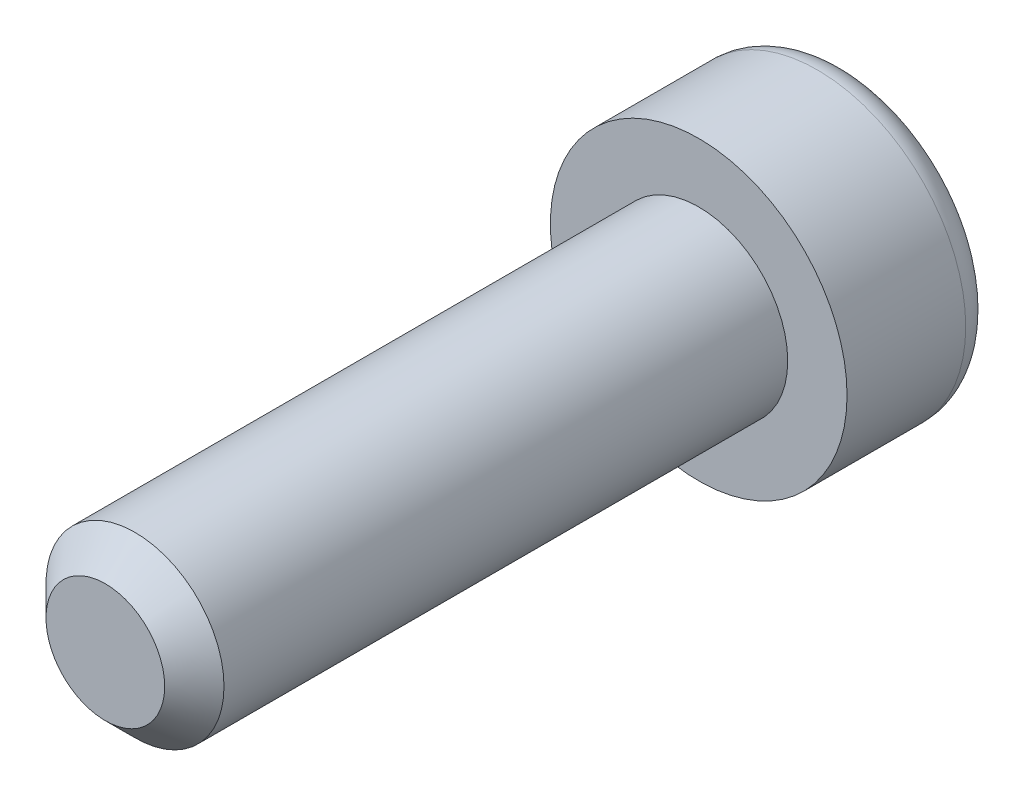
ISO-10303-21;
HEADER;
FILE_DESCRIPTION(('STEP AP214'),'2;1');
FILE_NAME('part.step','',(''),(''),'','','');
FILE_SCHEMA(('AUTOMOTIVE_DESIGN { 1 0 10303 214 1 1 1 1 }'));
ENDSEC;
DATA;
#1=APPLICATION_CONTEXT('core data for automotive mechanical design processes');
#2=APPLICATION_PROTOCOL_DEFINITION('international standard','automotive_design',2000,#1);
#3=PRODUCT_CONTEXT('',#1,'mechanical');
#4=PRODUCT('Part','Part','',(#3));
#5=PRODUCT_RELATED_PRODUCT_CATEGORY('part','',(#4));
#6=PRODUCT_DEFINITION_FORMATION('','',#4);
#7=PRODUCT_DEFINITION_CONTEXT('part definition',#1,'design');
#8=PRODUCT_DEFINITION('design','',#6,#7);
#9=PRODUCT_DEFINITION_SHAPE('','',#8);
#10=(LENGTH_UNIT() NAMED_UNIT(*) SI_UNIT(.MILLI.,.METRE.));
#11=(NAMED_UNIT(*) PLANE_ANGLE_UNIT() SI_UNIT($,.RADIAN.));
#12=(NAMED_UNIT(*) SI_UNIT($,.STERADIAN.) SOLID_ANGLE_UNIT());
#13=UNCERTAINTY_MEASURE_WITH_UNIT(LENGTH_MEASURE(1.E-05),#10,'distance_accuracy_value','');
#14=(GEOMETRIC_REPRESENTATION_CONTEXT(3) GLOBAL_UNCERTAINTY_ASSIGNED_CONTEXT((#13)) GLOBAL_UNIT_ASSIGNED_CONTEXT((#10,
#11,#12)) REPRESENTATION_CONTEXT('',''));
#15=CARTESIAN_POINT('',(0.,0.,0.));
#16=DIRECTION('',(0.,0.,1.));
#17=DIRECTION('',(1.,0.,0.));
#18=AXIS2_PLACEMENT_3D('',#15,#16,#17);
#19=CARTESIAN_POINT('',(0.,0.,0.));
#20=DIRECTION('',(0.,0.,1.));
#21=DIRECTION('',(1.,0.,0.));
#22=AXIS2_PLACEMENT_3D('',#19,#20,#21);
#23=PLANE('',#22);
#24=CARTESIAN_POINT('',(0.,0.,0.));
#25=DIRECTION('',(0.,0.,1.));
#26=DIRECTION('',(1.,0.,0.));
#27=AXIS2_PLACEMENT_3D('',#24,#25,#26);
#28=CIRCLE('',#27,2.);
#29=CARTESIAN_POINT('',(2.,0.,0.));
#30=VERTEX_POINT('',#29);
#31=EDGE_CURVE('E143',#30,#30,#28,.F.);
#32=ORIENTED_EDGE('',*,*,#31,.T.);
#33=EDGE_LOOP('',(#32));
#34=FACE_BOUND('',#33,.T.);
#35=DIRECTION('',(-0.86602540378444,-0.499999999999998,0.));
#36=VECTOR('',#35,1.);
#37=CARTESIAN_POINT('',(0.,1.45,0.));
#38=LINE('',#37,#36);
#39=CARTESIAN_POINT('',(0.,1.45,0.));
#40=VERTEX_POINT('',#39);
#41=CARTESIAN_POINT('',(-1.25,0.728312163512971,0.));
#42=VERTEX_POINT('',#41);
#43=EDGE_CURVE('E45',#40,#42,#38,.T.);
#44=ORIENTED_EDGE('',*,*,#43,.T.);
#45=DIRECTION('',(0.,-1.,0.));
#46=VECTOR('',#45,1.);
#47=CARTESIAN_POINT('',(-1.25,0.728312163512971,0.));
#48=LINE('',#47,#46);
#49=CARTESIAN_POINT('',(-1.25,-0.715063509461096,0.));
#50=VERTEX_POINT('',#49);
#51=EDGE_CURVE('E115',#42,#50,#48,.T.);
#52=ORIENTED_EDGE('',*,*,#51,.T.);
#53=DIRECTION('',(0.86602540378444,-0.499999999999998,0.));
#54=VECTOR('',#53,1.);
#55=CARTESIAN_POINT('',(-1.25,-0.715063509461096,0.));
#56=LINE('',#55,#54);
#57=CARTESIAN_POINT('',(0.,-1.43675134594813,0.));
#58=VERTEX_POINT('',#57);
#59=EDGE_CURVE('E118',#50,#58,#56,.T.);
#60=ORIENTED_EDGE('',*,*,#59,.T.);
#61=DIRECTION('',(-0.866025403784439,-0.499999999999998,0.));
#62=VECTOR('',#61,1.);
#63=CARTESIAN_POINT('',(1.25,-0.715063509461096,0.));
#64=LINE('',#63,#62);
#65=CARTESIAN_POINT('',(1.25,-0.715063509461096,0.));
#66=VERTEX_POINT('',#65);
#67=EDGE_CURVE('E121',#66,#58,#64,.T.);
#68=ORIENTED_EDGE('',*,*,#67,.F.);
#69=DIRECTION('',(0.,-1.,0.));
#70=VECTOR('',#69,1.);
#71=CARTESIAN_POINT('',(1.25,0.728312163512971,0.));
#72=LINE('',#71,#70);
#73=CARTESIAN_POINT('',(1.25,0.728312163512971,0.));
#74=VERTEX_POINT('',#73);
#75=EDGE_CURVE('E95',#74,#66,#72,.T.);
#76=ORIENTED_EDGE('',*,*,#75,.F.);
#77=DIRECTION('',(0.86602540378444,-0.499999999999998,0.));
#78=VECTOR('',#77,1.);
#79=CARTESIAN_POINT('',(0.,1.45,0.));
#80=LINE('',#79,#78);
#81=EDGE_CURVE('E124',#40,#74,#80,.T.);
#82=ORIENTED_EDGE('',*,*,#81,.F.);
#83=EDGE_LOOP('',(#44,#52,#60,#68,#76,#82));
#84=FACE_BOUND('',#83,.T.);
#85=ADVANCED_FACE('F30',(#34,#84),#23,.F.);
#86=CARTESIAN_POINT('',(0.,0.,2.5));
#87=DIRECTION('',(0.,0.,1.));
#88=DIRECTION('',(1.,0.,0.));
#89=AXIS2_PLACEMENT_3D('',#86,#87,#88);
#90=PLANE('',#89);
#91=CARTESIAN_POINT('',(0.,0.,2.5));
#92=DIRECTION('',(0.,0.,1.));
#93=DIRECTION('',(1.,0.,0.));
#94=AXIS2_PLACEMENT_3D('',#91,#92,#93);
#95=CIRCLE('',#94,2.5);
#96=CARTESIAN_POINT('',(2.5,0.,2.5));
#97=VERTEX_POINT('',#96);
#98=EDGE_CURVE('E137',#97,#97,#95,.T.);
#99=ORIENTED_EDGE('',*,*,#98,.T.);
#100=EDGE_LOOP('',(#99));
#101=FACE_BOUND('',#100,.T.);
#102=CARTESIAN_POINT('',(0.,0.,2.5));
#103=DIRECTION('',(0.,0.,1.));
#104=DIRECTION('',(1.,0.,0.));
#105=AXIS2_PLACEMENT_3D('',#102,#103,#104);
#106=CIRCLE('',#105,1.5);
#107=CARTESIAN_POINT('',(1.5,0.,2.5));
#108=VERTEX_POINT('',#107);
#109=EDGE_CURVE('E134',#108,#108,#106,.T.);
#110=ORIENTED_EDGE('',*,*,#109,.F.);
#111=EDGE_LOOP('',(#110));
#112=FACE_BOUND('',#111,.T.);
#113=ADVANCED_FACE('F159',(#101,#112),#90,.T.);
#114=CARTESIAN_POINT('',(0.,0.,2.5));
#115=DIRECTION('',(0.,0.,-1.));
#116=DIRECTION('',(-1.,0.,0.));
#117=AXIS2_PLACEMENT_3D('',#114,#115,#116);
#118=CYLINDRICAL_SURFACE('',#117,2.5);
#119=CARTESIAN_POINT('',(0.,0.,0.5));
#120=DIRECTION('',(0.,0.,1.));
#121=DIRECTION('',(1.,0.,0.));
#122=AXIS2_PLACEMENT_3D('',#119,#120,#121);
#123=CIRCLE('',#122,2.5);
#124=CARTESIAN_POINT('',(2.5,0.,0.5));
#125=VERTEX_POINT('',#124);
#126=EDGE_CURVE('E140',#125,#125,#123,.T.);
#127=ORIENTED_EDGE('',*,*,#126,.T.);
#128=EDGE_LOOP('',(#127));
#129=FACE_BOUND('',#128,.T.);
#130=ORIENTED_EDGE('',*,*,#98,.F.);
#131=EDGE_LOOP('',(#130));
#132=FACE_BOUND('',#131,.T.);
#133=ADVANCED_FACE('F165',(#129,#132),#118,.T.);
#134=CARTESIAN_POINT('',(0.,0.,12.5));
#135=DIRECTION('',(0.,0.,-1.));
#136=DIRECTION('',(-1.,0.,0.));
#137=AXIS2_PLACEMENT_3D('',#134,#135,#136);
#138=CYLINDRICAL_SURFACE('',#137,1.5);
#139=CARTESIAN_POINT('',(0.,0.,12.));
#140=DIRECTION('',(0.,0.,1.));
#141=DIRECTION('',(1.,0.,0.));
#142=AXIS2_PLACEMENT_3D('',#139,#140,#141);
#143=CIRCLE('',#142,1.5);
#144=CARTESIAN_POINT('',(1.5,0.,12.));
#145=VERTEX_POINT('',#144);
#146=EDGE_CURVE('E11',#145,#145,#143,.F.);
#147=ORIENTED_EDGE('',*,*,#146,.T.);
#148=EDGE_LOOP('',(#147));
#149=FACE_BOUND('',#148,.T.);
#150=ORIENTED_EDGE('',*,*,#109,.T.);
#151=EDGE_LOOP('',(#150));
#152=FACE_BOUND('',#151,.T.);
#153=ADVANCED_FACE('F172',(#149,#152),#138,.T.);
#154=CARTESIAN_POINT('',(0.,0.,12.5));
#155=DIRECTION('',(0.,0.,1.));
#156=DIRECTION('',(1.,0.,0.));
#157=AXIS2_PLACEMENT_3D('',#154,#155,#156);
#158=PLANE('',#157);
#159=CARTESIAN_POINT('',(0.,0.,12.5));
#160=DIRECTION('',(0.,0.,1.));
#161=DIRECTION('',(1.,0.,0.));
#162=AXIS2_PLACEMENT_3D('',#159,#160,#161);
#163=CIRCLE('',#162,0.999999999999999);
#164=CARTESIAN_POINT('',(0.999999999999999,0.,12.5));
#165=VERTEX_POINT('',#164);
#166=EDGE_CURVE('E38',#165,#165,#163,.T.);
#167=ORIENTED_EDGE('',*,*,#166,.T.);
#168=EDGE_LOOP('',(#167));
#169=FACE_BOUND('',#168,.T.);
#170=ADVANCED_FACE('F148',(#169),#158,.T.);
#171=CARTESIAN_POINT('',(0.,1.45,2.));
#172=DIRECTION('',(0.499999999999998,-0.86602540378444,0.));
#173=DIRECTION('',(0.86602540378444,0.499999999999998,0.));
#174=AXIS2_PLACEMENT_3D('',#171,#172,#173);
#175=PLANE('',#174);
#176=ORIENTED_EDGE('',*,*,#43,.F.);
#177=DIRECTION('',(0.,0.,-1.));
#178=VECTOR('',#177,1.);
#179=CARTESIAN_POINT('',(0.,1.45,2.));
#180=LINE('',#179,#178);
#181=CARTESIAN_POINT('',(0.,1.45,2.));
#182=VERTEX_POINT('',#181);
#183=EDGE_CURVE('E50',#182,#40,#180,.T.);
#184=ORIENTED_EDGE('',*,*,#183,.F.);
#185=DIRECTION('',(-0.86602540378444,-0.499999999999998,0.));
#186=VECTOR('',#185,1.);
#187=CARTESIAN_POINT('',(0.,1.45,2.));
#188=LINE('',#187,#186);
#189=CARTESIAN_POINT('',(-1.25,0.728312163512971,2.));
#190=VERTEX_POINT('',#189);
#191=EDGE_CURVE('E126',#182,#190,#188,.T.);
#192=ORIENTED_EDGE('',*,*,#191,.T.);
#193=DIRECTION('',(0.,0.,-1.));
#194=VECTOR('',#193,1.);
#195=CARTESIAN_POINT('',(-1.25,0.728312163512971,2.));
#196=LINE('',#195,#194);
#197=EDGE_CURVE('E132',#190,#42,#196,.T.);
#198=ORIENTED_EDGE('',*,*,#197,.T.);
#199=EDGE_LOOP('',(#176,#184,#192,#198));
#200=FACE_BOUND('',#199,.T.);
#201=ADVANCED_FACE('F188',(#200),#175,.T.);
#202=CARTESIAN_POINT('',(-1.25,0.728312163512971,2.));
#203=DIRECTION('',(1.,0.,0.));
#204=DIRECTION('',(0.,1.,0.));
#205=AXIS2_PLACEMENT_3D('',#202,#203,#204);
#206=PLANE('',#205);
#207=ORIENTED_EDGE('',*,*,#51,.F.);
#208=ORIENTED_EDGE('',*,*,#197,.F.);
#209=DIRECTION('',(0.,-1.,0.));
#210=VECTOR('',#209,1.);
#211=CARTESIAN_POINT('',(-1.25,0.728312163512971,2.));
#212=LINE('',#211,#210);
#213=CARTESIAN_POINT('',(-1.25,-0.715063509461096,2.));
#214=VERTEX_POINT('',#213);
#215=EDGE_CURVE('E82',#190,#214,#212,.T.);
#216=ORIENTED_EDGE('',*,*,#215,.T.);
#217=DIRECTION('',(0.,0.,-1.));
#218=VECTOR('',#217,1.);
#219=CARTESIAN_POINT('',(-1.25,-0.715063509461096,2.));
#220=LINE('',#219,#218);
#221=EDGE_CURVE('E130',#214,#50,#220,.T.);
#222=ORIENTED_EDGE('',*,*,#221,.T.);
#223=EDGE_LOOP('',(#207,#208,#216,#222));
#224=FACE_BOUND('',#223,.T.);
#225=ADVANCED_FACE('F193',(#224),#206,.T.);
#226=CARTESIAN_POINT('',(-1.25,-0.715063509461096,2.));
#227=DIRECTION('',(0.499999999999998,0.86602540378444,0.));
#228=DIRECTION('',(-0.86602540378444,0.499999999999998,0.));
#229=AXIS2_PLACEMENT_3D('',#226,#227,#228);
#230=PLANE('',#229);
#231=ORIENTED_EDGE('',*,*,#59,.F.);
#232=ORIENTED_EDGE('',*,*,#221,.F.);
#233=DIRECTION('',(0.86602540378444,-0.499999999999998,0.));
#234=VECTOR('',#233,1.);
#235=CARTESIAN_POINT('',(-1.25,-0.715063509461096,2.));
#236=LINE('',#235,#234);
#237=CARTESIAN_POINT('',(0.,-1.43675134594813,2.));
#238=VERTEX_POINT('',#237);
#239=EDGE_CURVE('E105',#214,#238,#236,.T.);
#240=ORIENTED_EDGE('',*,*,#239,.T.);
#241=DIRECTION('',(0.,0.,-1.));
#242=VECTOR('',#241,1.);
#243=CARTESIAN_POINT('',(0.,-1.43675134594813,2.));
#244=LINE('',#243,#242);
#245=EDGE_CURVE('E99',#238,#58,#244,.T.);
#246=ORIENTED_EDGE('',*,*,#245,.T.);
#247=EDGE_LOOP('',(#231,#232,#240,#246));
#248=FACE_BOUND('',#247,.T.);
#249=ADVANCED_FACE('F196',(#248),#230,.T.);
#250=CARTESIAN_POINT('',(1.25,-0.715063509461096,2.));
#251=DIRECTION('',(0.499999999999998,-0.86602540378444,0.));
#252=DIRECTION('',(0.86602540378444,0.499999999999998,0.));
#253=AXIS2_PLACEMENT_3D('',#250,#251,#252);
#254=PLANE('',#253);
#255=ORIENTED_EDGE('',*,*,#67,.T.);
#256=ORIENTED_EDGE('',*,*,#245,.F.);
#257=DIRECTION('',(-0.866025403784439,-0.499999999999998,0.));
#258=VECTOR('',#257,1.);
#259=CARTESIAN_POINT('',(1.25,-0.715063509461096,2.));
#260=LINE('',#259,#258);
#261=CARTESIAN_POINT('',(1.25,-0.715063509461096,2.));
#262=VERTEX_POINT('',#261);
#263=EDGE_CURVE('E103',#262,#238,#260,.T.);
#264=ORIENTED_EDGE('',*,*,#263,.F.);
#265=DIRECTION('',(0.,0.,-1.));
#266=VECTOR('',#265,1.);
#267=CARTESIAN_POINT('',(1.25,-0.715063509461096,2.));
#268=LINE('',#267,#266);
#269=EDGE_CURVE('E88',#262,#66,#268,.T.);
#270=ORIENTED_EDGE('',*,*,#269,.T.);
#271=EDGE_LOOP('',(#255,#256,#264,#270));
#272=FACE_BOUND('',#271,.T.);
#273=ADVANCED_FACE('F104',(#272),#254,.F.);
#274=CARTESIAN_POINT('',(1.25,0.728312163512971,2.));
#275=DIRECTION('',(1.,0.,0.));
#276=DIRECTION('',(0.,1.,0.));
#277=AXIS2_PLACEMENT_3D('',#274,#275,#276);
#278=PLANE('',#277);
#279=ORIENTED_EDGE('',*,*,#75,.T.);
#280=ORIENTED_EDGE('',*,*,#269,.F.);
#281=DIRECTION('',(0.,-1.,0.));
#282=VECTOR('',#281,1.);
#283=CARTESIAN_POINT('',(1.25,0.728312163512971,2.));
#284=LINE('',#283,#282);
#285=CARTESIAN_POINT('',(1.25,0.728312163512971,2.));
#286=VERTEX_POINT('',#285);
#287=EDGE_CURVE('E92',#286,#262,#284,.T.);
#288=ORIENTED_EDGE('',*,*,#287,.F.);
#289=DIRECTION('',(0.,0.,-1.));
#290=VECTOR('',#289,1.);
#291=CARTESIAN_POINT('',(1.25,0.728312163512971,2.));
#292=LINE('',#291,#290);
#293=EDGE_CURVE('E74',#286,#74,#292,.T.);
#294=ORIENTED_EDGE('',*,*,#293,.T.);
#295=EDGE_LOOP('',(#279,#280,#288,#294));
#296=FACE_BOUND('',#295,.T.);
#297=ADVANCED_FACE('F90',(#296),#278,.F.);
#298=CARTESIAN_POINT('',(0.,1.45,2.));
#299=DIRECTION('',(0.499999999999998,0.86602540378444,0.));
#300=DIRECTION('',(-0.86602540378444,0.499999999999998,0.));
#301=AXIS2_PLACEMENT_3D('',#298,#299,#300);
#302=PLANE('',#301);
#303=ORIENTED_EDGE('',*,*,#81,.T.);
#304=ORIENTED_EDGE('',*,*,#293,.F.);
#305=DIRECTION('',(0.86602540378444,-0.499999999999998,0.));
#306=VECTOR('',#305,1.);
#307=CARTESIAN_POINT('',(0.,1.45,2.));
#308=LINE('',#307,#306);
#309=EDGE_CURVE('E109',#182,#286,#308,.T.);
#310=ORIENTED_EDGE('',*,*,#309,.F.);
#311=ORIENTED_EDGE('',*,*,#183,.T.);
#312=EDGE_LOOP('',(#303,#304,#310,#311));
#313=FACE_BOUND('',#312,.T.);
#314=ADVANCED_FACE('F205',(#313),#302,.F.);
#315=CARTESIAN_POINT('',(-1.25,0.728312163512971,2.));
#316=DIRECTION('',(0.,0.,1.));
#317=DIRECTION('',(1.,0.,0.));
#318=AXIS2_PLACEMENT_3D('',#315,#316,#317);
#319=PLANE('',#318);
#320=ORIENTED_EDGE('',*,*,#191,.F.);
#321=ORIENTED_EDGE('',*,*,#309,.T.);
#322=ORIENTED_EDGE('',*,*,#287,.T.);
#323=ORIENTED_EDGE('',*,*,#263,.T.);
#324=ORIENTED_EDGE('',*,*,#239,.F.);
#325=ORIENTED_EDGE('',*,*,#215,.F.);
#326=EDGE_LOOP('',(#320,#321,#322,#323,#324,#325));
#327=FACE_BOUND('',#326,.T.);
#328=ADVANCED_FACE('F107',(#327),#319,.F.);
#329=CARTESIAN_POINT('',(0.,0.,0.5));
#330=DIRECTION('',(0.,0.,1.));
#331=DIRECTION('',(1.,0.,0.));
#332=AXIS2_PLACEMENT_3D('',#329,#330,#331);
#333=TOROIDAL_SURFACE('',#332,2.,0.5);
#334=ORIENTED_EDGE('',*,*,#31,.F.);
#335=EDGE_LOOP('',(#334));
#336=FACE_BOUND('',#335,.T.);
#337=ORIENTED_EDGE('',*,*,#126,.F.);
#338=EDGE_LOOP('',(#337));
#339=FACE_BOUND('',#338,.T.);
#340=ADVANCED_FACE('F151',(#336,#339),#333,.T.);
#341=CARTESIAN_POINT('',(0.,0.,12.5));
#342=DIRECTION('',(0.,0.,-1.));
#343=DIRECTION('',(-1.,0.,0.));
#344=AXIS2_PLACEMENT_3D('',#341,#342,#343);
#345=CONICAL_SURFACE('',#344,0.999999999999999,0.785398163397446);
#346=ORIENTED_EDGE('',*,*,#146,.F.);
#347=EDGE_LOOP('',(#346));
#348=FACE_BOUND('',#347,.T.);
#349=ORIENTED_EDGE('',*,*,#166,.F.);
#350=EDGE_LOOP('',(#349));
#351=FACE_BOUND('',#350,.T.);
#352=ADVANCED_FACE('F32',(#348,#351),#345,.T.);
#353=CLOSED_SHELL('',(#85,#113,#133,#153,#170,#201,#225,#249,#273,#297,#314,#328,#340,#352));
#354=MANIFOLD_SOLID_BREP('B2',#353);
#355=ADVANCED_BREP_SHAPE_REPRESENTATION('',(#18,#354),#14);
#356=SHAPE_DEFINITION_REPRESENTATION(#9,#355);
ENDSEC;
END-ISO-10303-21;
